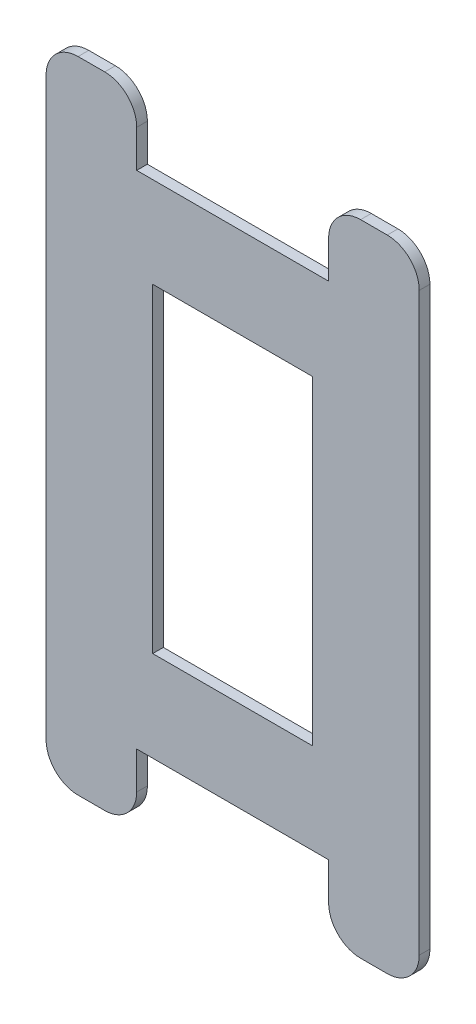
ISO-10303-21;
HEADER;
FILE_DESCRIPTION(('STEP AP214'),'2;1');
FILE_NAME('part.step','',(''),(''),'','','');
FILE_SCHEMA(('AUTOMOTIVE_DESIGN { 1 0 10303 214 1 1 1 1 }'));
ENDSEC;
DATA;
#1=APPLICATION_CONTEXT('core data for automotive mechanical design processes');
#2=APPLICATION_PROTOCOL_DEFINITION('international standard','automotive_design',2000,#1);
#3=PRODUCT_CONTEXT('',#1,'mechanical');
#4=PRODUCT('Part','Part','',(#3));
#5=PRODUCT_RELATED_PRODUCT_CATEGORY('part','',(#4));
#6=PRODUCT_DEFINITION_FORMATION('','',#4);
#7=PRODUCT_DEFINITION_CONTEXT('part definition',#1,'design');
#8=PRODUCT_DEFINITION('design','',#6,#7);
#9=PRODUCT_DEFINITION_SHAPE('','',#8);
#10=(LENGTH_UNIT() NAMED_UNIT(*) SI_UNIT(.MILLI.,.METRE.));
#11=(NAMED_UNIT(*) PLANE_ANGLE_UNIT() SI_UNIT($,.RADIAN.));
#12=(NAMED_UNIT(*) SI_UNIT($,.STERADIAN.) SOLID_ANGLE_UNIT());
#13=UNCERTAINTY_MEASURE_WITH_UNIT(LENGTH_MEASURE(1.E-05),#10,'distance_accuracy_value','');
#14=(GEOMETRIC_REPRESENTATION_CONTEXT(3) GLOBAL_UNCERTAINTY_ASSIGNED_CONTEXT((#13)) GLOBAL_UNIT_ASSIGNED_CONTEXT((#10,
#11,#12)) REPRESENTATION_CONTEXT('',''));
#15=CARTESIAN_POINT('',(0.,0.,0.));
#16=DIRECTION('',(0.,0.,1.));
#17=DIRECTION('',(1.,0.,0.));
#18=AXIS2_PLACEMENT_3D('',#15,#16,#17);
#19=CARTESIAN_POINT('',(54.4503896425,-22.42083694663,4.7927));
#20=DIRECTION('',(1.,0.,0.));
#21=DIRECTION('',(0.,1.,0.));
#22=AXIS2_PLACEMENT_3D('',#19,#20,#21);
#23=PLANE('',#22);
#24=DIRECTION('',(-1.00071054263569E-10,0.,-1.));
#25=VECTOR('',#24,1.);
#26=CARTESIAN_POINT('',(54.45038964251,-22.77083694664,4.79270000001));
#27=LINE('',#26,#25);
#28=CARTESIAN_POINT('',(54.4503896425,-22.77083694663,4.7927));
#29=VERTEX_POINT('',#28);
#30=CARTESIAN_POINT('',(54.4503896425,-22.77083694663,4.6927));
#31=VERTEX_POINT('',#30);
#32=EDGE_CURVE('E11',#29,#31,#27,.T.);
#33=ORIENTED_EDGE('',*,*,#32,.F.);
#34=DIRECTION('',(0.,1.,0.));
#35=VECTOR('',#34,1.);
#36=CARTESIAN_POINT('',(54.45038964251,-22.77083694664,4.79270000001));
#37=LINE('',#36,#35);
#38=CARTESIAN_POINT('',(54.4503896425,-22.42083694663,4.7927));
#39=VERTEX_POINT('',#38);
#40=EDGE_CURVE('E260',#29,#39,#37,.T.);
#41=ORIENTED_EDGE('',*,*,#40,.T.);
#42=DIRECTION('',(0.,0.,1.));
#43=VECTOR('',#42,1.);
#44=CARTESIAN_POINT('',(54.45038964251,-22.42083694664,4.69270000001));
#45=LINE('',#44,#43);
#46=CARTESIAN_POINT('',(54.4503896425,-22.42083694663,4.6927));
#47=VERTEX_POINT('',#46);
#48=EDGE_CURVE('E253',#47,#39,#45,.T.);
#49=ORIENTED_EDGE('',*,*,#48,.F.);
#50=DIRECTION('',(-2.85917297916334E-11,1.,0.));
#51=VECTOR('',#50,1.);
#52=CARTESIAN_POINT('',(54.45038964251,-22.77083694664,4.69270000001));
#53=LINE('',#52,#51);
#54=EDGE_CURVE('E235',#31,#47,#53,.T.);
#55=ORIENTED_EDGE('',*,*,#54,.F.);
#56=EDGE_LOOP('',(#33,#41,#49,#55));
#57=FACE_BOUND('',#56,.T.);
#58=ADVANCED_FACE('F17',(#57),#23,.F.);
#59=CARTESIAN_POINT('',(54.7503896425,-22.77083694663,4.7927));
#60=DIRECTION('',(0.,0.,-1.));
#61=DIRECTION('',(1.,0.,0.));
#62=AXIS2_PLACEMENT_3D('',#59,#60,#61);
#63=CYLINDRICAL_SURFACE('',#62,0.3);
#64=DIRECTION('',(0.,0.,1.));
#65=VECTOR('',#64,1.);
#66=CARTESIAN_POINT('',(54.75038964251,-23.07083694664,4.69270000001));
#67=LINE('',#66,#65);
#68=CARTESIAN_POINT('',(54.7503896425,-23.07083694663,4.6927));
#69=VERTEX_POINT('',#68);
#70=CARTESIAN_POINT('',(54.7503896425,-23.07083694663,4.7927));
#71=VERTEX_POINT('',#70);
#72=EDGE_CURVE('E27',#69,#71,#67,.T.);
#73=ORIENTED_EDGE('',*,*,#72,.T.);
#74=CARTESIAN_POINT('',(54.75038964251,-22.77083694664,4.79270000001));
#75=DIRECTION('',(0.,0.,1.));
#76=DIRECTION('',(-1.,3.35464961529431E-11,0.));
#77=AXIS2_PLACEMENT_3D('',#74,#75,#76);
#78=CIRCLE('',#77,0.30000000001);
#79=EDGE_CURVE('E417',#29,#71,#78,.T.);
#80=ORIENTED_EDGE('',*,*,#79,.F.);
#81=ORIENTED_EDGE('',*,*,#32,.T.);
#82=CARTESIAN_POINT('',(54.75038964251,-22.77083694664,4.69270000001));
#83=DIRECTION('',(0.,0.,-1.));
#84=DIRECTION('',(0.,-1.,0.));
#85=AXIS2_PLACEMENT_3D('',#82,#83,#84);
#86=CIRCLE('',#85,0.30000000001);
#87=EDGE_CURVE('E243',#69,#31,#86,.T.);
#88=ORIENTED_EDGE('',*,*,#87,.F.);
#89=EDGE_LOOP('',(#73,#80,#81,#88));
#90=FACE_BOUND('',#89,.T.);
#91=ADVANCED_FACE('F19',(#90),#63,.T.);
#92=CARTESIAN_POINT('',(54.7503896425,-23.07083694663,4.7927));
#93=DIRECTION('',(0.,1.,0.));
#94=DIRECTION('',(1.,0.,0.));
#95=AXIS2_PLACEMENT_3D('',#92,#93,#94);
#96=PLANE('',#95);
#97=DIRECTION('',(0.,0.,-1.));
#98=VECTOR('',#97,1.);
#99=CARTESIAN_POINT('',(55.00038964251,-23.07083694664,4.79270000001));
#100=LINE('',#99,#98);
#101=CARTESIAN_POINT('',(55.0003896425,-23.07083694663,4.7927));
#102=VERTEX_POINT('',#101);
#103=CARTESIAN_POINT('',(55.0003896425,-23.07083694663,4.6927));
#104=VERTEX_POINT('',#103);
#105=EDGE_CURVE('E392',#102,#104,#100,.T.);
#106=ORIENTED_EDGE('',*,*,#105,.F.);
#107=DIRECTION('',(-1.,0.,0.));
#108=VECTOR('',#107,1.);
#109=CARTESIAN_POINT('',(55.00038964251,-23.07083694664,4.79270000001));
#110=LINE('',#109,#108);
#111=EDGE_CURVE('E321',#102,#71,#110,.T.);
#112=ORIENTED_EDGE('',*,*,#111,.T.);
#113=ORIENTED_EDGE('',*,*,#72,.F.);
#114=DIRECTION('',(-1.,0.,0.));
#115=VECTOR('',#114,1.);
#116=CARTESIAN_POINT('',(55.00038964251,-23.07083694664,4.69270000001));
#117=LINE('',#116,#115);
#118=EDGE_CURVE('E371',#104,#69,#117,.T.);
#119=ORIENTED_EDGE('',*,*,#118,.F.);
#120=EDGE_LOOP('',(#106,#112,#113,#119));
#121=FACE_BOUND('',#120,.T.);
#122=ADVANCED_FACE('F518',(#121),#96,.F.);
#123=CARTESIAN_POINT('',(55.0003896425,-22.77083694663,4.7927));
#124=DIRECTION('',(0.,0.,-1.));
#125=DIRECTION('',(1.,0.,0.));
#126=AXIS2_PLACEMENT_3D('',#123,#124,#125);
#127=CYLINDRICAL_SURFACE('',#126,0.3);
#128=DIRECTION('',(0.,0.,1.));
#129=VECTOR('',#128,1.);
#130=CARTESIAN_POINT('',(55.30038964251,-22.77083694664,4.69270000001));
#131=LINE('',#130,#129);
#132=CARTESIAN_POINT('',(55.3003896425,-22.77083694663,4.6927));
#133=VERTEX_POINT('',#132);
#134=CARTESIAN_POINT('',(55.3003896425,-22.77083694663,4.7927));
#135=VERTEX_POINT('',#134);
#136=EDGE_CURVE('E21',#133,#135,#131,.T.);
#137=ORIENTED_EDGE('',*,*,#136,.T.);
#138=CARTESIAN_POINT('',(55.00038964251,-22.77083694664,4.79270000001));
#139=DIRECTION('',(0.,0.,1.));
#140=DIRECTION('',(0.,-1.,0.));
#141=AXIS2_PLACEMENT_3D('',#138,#139,#140);
#142=CIRCLE('',#141,0.30000000001);
#143=EDGE_CURVE('E316',#102,#135,#142,.T.);
#144=ORIENTED_EDGE('',*,*,#143,.F.);
#145=ORIENTED_EDGE('',*,*,#105,.T.);
#146=CARTESIAN_POINT('',(55.00038964251,-22.77083694664,4.69270000001));
#147=DIRECTION('',(0.,0.,-1.));
#148=DIRECTION('',(1.,-3.33451757111511E-11,0.));
#149=AXIS2_PLACEMENT_3D('',#146,#147,#148);
#150=CIRCLE('',#149,0.30000000001);
#151=EDGE_CURVE('E367',#133,#104,#150,.T.);
#152=ORIENTED_EDGE('',*,*,#151,.F.);
#153=EDGE_LOOP('',(#137,#144,#145,#152));
#154=FACE_BOUND('',#153,.T.);
#155=ADVANCED_FACE('F509',(#154),#127,.T.);
#156=CARTESIAN_POINT('',(55.3003896425,-17.37083694663,4.7927));
#157=DIRECTION('',(-1.,0.,0.));
#158=DIRECTION('',(0.,0.,1.));
#159=AXIS2_PLACEMENT_3D('',#156,#157,#158);
#160=PLANE('',#159);
#161=DIRECTION('',(0.,0.,-1.));
#162=VECTOR('',#161,1.);
#163=CARTESIAN_POINT('',(55.30038964251,-17.37083694664,4.79270000001));
#164=LINE('',#163,#162);
#165=CARTESIAN_POINT('',(55.3003896425,-17.37083694663,4.7927));
#166=VERTEX_POINT('',#165);
#167=CARTESIAN_POINT('',(55.3003896425,-17.37083694663,4.6927));
#168=VERTEX_POINT('',#167);
#169=EDGE_CURVE('E495',#166,#168,#164,.T.);
#170=ORIENTED_EDGE('',*,*,#169,.F.);
#171=DIRECTION('',(0.,-1.,0.));
#172=VECTOR('',#171,1.);
#173=CARTESIAN_POINT('',(55.30038964251,-17.37083694664,4.79270000001));
#174=LINE('',#173,#172);
#175=EDGE_CURVE('E320',#166,#135,#174,.T.);
#176=ORIENTED_EDGE('',*,*,#175,.T.);
#177=ORIENTED_EDGE('',*,*,#136,.F.);
#178=DIRECTION('',(0.,-1.,0.));
#179=VECTOR('',#178,1.);
#180=CARTESIAN_POINT('',(55.30038964251,-17.37083694664,4.69270000001));
#181=LINE('',#180,#179);
#182=EDGE_CURVE('E363',#168,#133,#181,.T.);
#183=ORIENTED_EDGE('',*,*,#182,.F.);
#184=EDGE_LOOP('',(#170,#176,#177,#183));
#185=FACE_BOUND('',#184,.T.);
#186=ADVANCED_FACE('F513',(#185),#160,.F.);
#187=CARTESIAN_POINT('',(55.0003896425,-17.37083694663,4.7927));
#188=DIRECTION('',(0.,0.,-1.));
#189=DIRECTION('',(1.,0.,0.));
#190=AXIS2_PLACEMENT_3D('',#187,#188,#189);
#191=CYLINDRICAL_SURFACE('',#190,0.3);
#192=DIRECTION('',(0.,0.,1.));
#193=VECTOR('',#192,1.);
#194=CARTESIAN_POINT('',(55.00038964251,-17.07083694664,4.69270000001));
#195=LINE('',#194,#193);
#196=CARTESIAN_POINT('',(55.0003896425,-17.07083694663,4.6927));
#197=VERTEX_POINT('',#196);
#198=CARTESIAN_POINT('',(55.0003896425,-17.07083694663,4.7927));
#199=VERTEX_POINT('',#198);
#200=EDGE_CURVE('E493',#197,#199,#195,.T.);
#201=ORIENTED_EDGE('',*,*,#200,.T.);
#202=CARTESIAN_POINT('',(55.00038964251,-17.37083694664,4.79270000001));
#203=DIRECTION('',(0.,0.,1.));
#204=DIRECTION('',(1.,0.,0.));
#205=AXIS2_PLACEMENT_3D('',#202,#203,#204);
#206=CIRCLE('',#205,0.30000000001);
#207=EDGE_CURVE('E383',#166,#199,#206,.T.);
#208=ORIENTED_EDGE('',*,*,#207,.F.);
#209=ORIENTED_EDGE('',*,*,#169,.T.);
#210=CARTESIAN_POINT('',(55.00038964251,-17.37083694664,4.69270000001));
#211=DIRECTION('',(0.,0.,-1.));
#212=DIRECTION('',(0.,1.,0.));
#213=AXIS2_PLACEMENT_3D('',#210,#211,#212);
#214=CIRCLE('',#213,0.30000000001);
#215=EDGE_CURVE('E359',#197,#168,#214,.T.);
#216=ORIENTED_EDGE('',*,*,#215,.F.);
#217=EDGE_LOOP('',(#201,#208,#209,#216));
#218=FACE_BOUND('',#217,.T.);
#219=ADVANCED_FACE('F521',(#218),#191,.T.);
#220=CARTESIAN_POINT('',(54.7503896425,-17.07083694663,4.7927));
#221=DIRECTION('',(0.,-1.,0.));
#222=DIRECTION('',(0.,0.,-1.));
#223=AXIS2_PLACEMENT_3D('',#220,#221,#222);
#224=PLANE('',#223);
#225=DIRECTION('',(0.,0.,-1.));
#226=VECTOR('',#225,1.);
#227=CARTESIAN_POINT('',(54.75038964251,-17.07083694664,4.79270000001));
#228=LINE('',#227,#226);
#229=CARTESIAN_POINT('',(54.7503896425,-17.07083694663,4.7927));
#230=VERTEX_POINT('',#229);
#231=CARTESIAN_POINT('',(54.7503896425,-17.07083694663,4.6927));
#232=VERTEX_POINT('',#231);
#233=EDGE_CURVE('E490',#230,#232,#228,.T.);
#234=ORIENTED_EDGE('',*,*,#233,.F.);
#235=DIRECTION('',(1.,0.,0.));
#236=VECTOR('',#235,1.);
#237=CARTESIAN_POINT('',(54.75038964251,-17.07083694664,4.79270000001));
#238=LINE('',#237,#236);
#239=EDGE_CURVE('E421',#230,#199,#238,.T.);
#240=ORIENTED_EDGE('',*,*,#239,.T.);
#241=ORIENTED_EDGE('',*,*,#200,.F.);
#242=DIRECTION('',(1.,0.,0.));
#243=VECTOR('',#242,1.);
#244=CARTESIAN_POINT('',(54.75038964251,-17.07083694664,4.69270000001));
#245=LINE('',#244,#243);
#246=EDGE_CURVE('E304',#232,#197,#245,.T.);
#247=ORIENTED_EDGE('',*,*,#246,.F.);
#248=EDGE_LOOP('',(#234,#240,#241,#247));
#249=FACE_BOUND('',#248,.T.);
#250=ADVANCED_FACE('F524',(#249),#224,.F.);
#251=CARTESIAN_POINT('',(54.7503896425,-17.37083694663,4.7927));
#252=DIRECTION('',(0.,0.,-1.));
#253=DIRECTION('',(1.,0.,0.));
#254=AXIS2_PLACEMENT_3D('',#251,#252,#253);
#255=CYLINDRICAL_SURFACE('',#254,0.3);
#256=DIRECTION('',(-1.00071054263569E-10,0.,1.));
#257=VECTOR('',#256,1.);
#258=CARTESIAN_POINT('',(54.45038964251,-17.37083694664,4.69270000001));
#259=LINE('',#258,#257);
#260=CARTESIAN_POINT('',(54.4503896425,-17.37083694663,4.6927));
#261=VERTEX_POINT('',#260);
#262=CARTESIAN_POINT('',(54.4503896425,-17.37083694663,4.7927));
#263=VERTEX_POINT('',#262);
#264=EDGE_CURVE('E280',#261,#263,#259,.T.);
#265=ORIENTED_EDGE('',*,*,#264,.T.);
#266=CARTESIAN_POINT('',(54.75038964251,-17.37083694664,4.79270000001));
#267=DIRECTION('',(0.,0.,1.));
#268=DIRECTION('',(0.,1.,0.));
#269=AXIS2_PLACEMENT_3D('',#266,#267,#268);
#270=CIRCLE('',#269,0.30000000001);
#271=EDGE_CURVE('E431',#230,#263,#270,.T.);
#272=ORIENTED_EDGE('',*,*,#271,.F.);
#273=ORIENTED_EDGE('',*,*,#233,.T.);
#274=CARTESIAN_POINT('',(54.75038964251,-17.37083694664,4.69270000001));
#275=DIRECTION('',(0.,0.,-1.));
#276=DIRECTION('',(-1.,-3.35346537740142E-11,0.));
#277=AXIS2_PLACEMENT_3D('',#274,#275,#276);
#278=CIRCLE('',#277,0.30000000001);
#279=EDGE_CURVE('E301',#261,#232,#278,.T.);
#280=ORIENTED_EDGE('',*,*,#279,.F.);
#281=EDGE_LOOP('',(#265,#272,#273,#280));
#282=FACE_BOUND('',#281,.T.);
#283=ADVANCED_FACE('F529',(#282),#255,.T.);
#284=CARTESIAN_POINT('',(54.4503896425,-17.72083694663,4.7927));
#285=DIRECTION('',(1.,0.,0.));
#286=DIRECTION('',(0.,1.,0.));
#287=AXIS2_PLACEMENT_3D('',#284,#285,#286);
#288=PLANE('',#287);
#289=DIRECTION('',(0.,0.,1.));
#290=VECTOR('',#289,1.);
#291=CARTESIAN_POINT('',(54.45038964251,-17.72083694664,4.69270000001));
#292=LINE('',#291,#290);
#293=CARTESIAN_POINT('',(54.4503896425,-17.72083694663,4.6927));
#294=VERTEX_POINT('',#293);
#295=CARTESIAN_POINT('',(54.4503896425,-17.72083694663,4.7927));
#296=VERTEX_POINT('',#295);
#297=EDGE_CURVE('E277',#294,#296,#292,.T.);
#298=ORIENTED_EDGE('',*,*,#297,.T.);
#299=DIRECTION('',(2.85917297916334E-11,1.,0.));
#300=VECTOR('',#299,1.);
#301=CARTESIAN_POINT('',(54.45038964251,-17.72083694664,4.79270000001));
#302=LINE('',#301,#300);
#303=EDGE_CURVE('E435',#296,#263,#302,.T.);
#304=ORIENTED_EDGE('',*,*,#303,.T.);
#305=ORIENTED_EDGE('',*,*,#264,.F.);
#306=DIRECTION('',(0.,1.,0.));
#307=VECTOR('',#306,1.);
#308=CARTESIAN_POINT('',(54.45038964251,-17.72083694664,4.69270000001));
#309=LINE('',#308,#307);
#310=EDGE_CURVE('E305',#294,#261,#309,.T.);
#311=ORIENTED_EDGE('',*,*,#310,.F.);
#312=EDGE_LOOP('',(#298,#304,#305,#311));
#313=FACE_BOUND('',#312,.T.);
#314=ADVANCED_FACE('F533',(#313),#288,.F.);
#315=CARTESIAN_POINT('',(52.6503896425,-17.72083694663,4.7927));
#316=DIRECTION('',(0.,-1.,0.));
#317=DIRECTION('',(0.,0.,-1.));
#318=AXIS2_PLACEMENT_3D('',#315,#316,#317);
#319=PLANE('',#318);
#320=DIRECTION('',(0.,0.,1.));
#321=VECTOR('',#320,1.);
#322=CARTESIAN_POINT('',(52.65038964251,-17.72083694664,4.69270000001));
#323=LINE('',#322,#321);
#324=CARTESIAN_POINT('',(52.6503896425,-17.72083694663,4.6927));
#325=VERTEX_POINT('',#324);
#326=CARTESIAN_POINT('',(52.6503896425,-17.72083694663,4.7927));
#327=VERTEX_POINT('',#326);
#328=EDGE_CURVE('E281',#325,#327,#323,.T.);
#329=ORIENTED_EDGE('',*,*,#328,.T.);
#330=DIRECTION('',(1.,0.,0.));
#331=VECTOR('',#330,1.);
#332=CARTESIAN_POINT('',(52.65038964251,-17.72083694664,4.79270000001));
#333=LINE('',#332,#331);
#334=EDGE_CURVE('E443',#327,#296,#333,.T.);
#335=ORIENTED_EDGE('',*,*,#334,.T.);
#336=ORIENTED_EDGE('',*,*,#297,.F.);
#337=DIRECTION('',(1.,0.,0.));
#338=VECTOR('',#337,1.);
#339=CARTESIAN_POINT('',(52.65038964251,-17.72083694664,4.69270000001));
#340=LINE('',#339,#338);
#341=EDGE_CURVE('E311',#325,#294,#340,.T.);
#342=ORIENTED_EDGE('',*,*,#341,.F.);
#343=EDGE_LOOP('',(#329,#335,#336,#342));
#344=FACE_BOUND('',#343,.T.);
#345=ADVANCED_FACE('F536',(#344),#319,.F.);
#346=CARTESIAN_POINT('',(52.6503896425,-17.72083694663,4.7927));
#347=DIRECTION('',(-1.,0.,0.));
#348=DIRECTION('',(0.,0.,1.));
#349=AXIS2_PLACEMENT_3D('',#346,#347,#348);
#350=PLANE('',#349);
#351=DIRECTION('',(0.,-1.00035527126784E-10,-1.));
#352=VECTOR('',#351,1.);
#353=CARTESIAN_POINT('',(52.65038964251,-17.37083694664,4.79270000001));
#354=LINE('',#353,#352);
#355=CARTESIAN_POINT('',(52.6503896425,-17.37083694663,4.7927));
#356=VERTEX_POINT('',#355);
#357=CARTESIAN_POINT('',(52.6503896425,-17.37083694663,4.6927));
#358=VERTEX_POINT('',#357);
#359=EDGE_CURVE('E343',#356,#358,#354,.T.);
#360=ORIENTED_EDGE('',*,*,#359,.F.);
#361=DIRECTION('',(0.,-1.,0.));
#362=VECTOR('',#361,1.);
#363=CARTESIAN_POINT('',(52.65038964251,-17.37083694664,4.79270000001));
#364=LINE('',#363,#362);
#365=EDGE_CURVE('E447',#356,#327,#364,.T.);
#366=ORIENTED_EDGE('',*,*,#365,.T.);
#367=ORIENTED_EDGE('',*,*,#328,.F.);
#368=DIRECTION('',(0.,-1.,0.));
#369=VECTOR('',#368,1.);
#370=CARTESIAN_POINT('',(52.65038964251,-17.37083694664,4.69270000001));
#371=LINE('',#370,#369);
#372=EDGE_CURVE('E315',#358,#325,#371,.T.);
#373=ORIENTED_EDGE('',*,*,#372,.F.);
#374=EDGE_LOOP('',(#360,#366,#367,#373));
#375=FACE_BOUND('',#374,.T.);
#376=ADVANCED_FACE('F541',(#375),#350,.F.);
#377=CARTESIAN_POINT('',(52.3503896425,-17.37083694663,4.7927));
#378=DIRECTION('',(0.,0.,-1.));
#379=DIRECTION('',(1.,0.,0.));
#380=AXIS2_PLACEMENT_3D('',#377,#378,#379);
#381=CYLINDRICAL_SURFACE('',#380,0.3);
#382=DIRECTION('',(0.,0.,1.));
#383=VECTOR('',#382,1.);
#384=CARTESIAN_POINT('',(52.35038964251,-17.07083694664,4.69270000001));
#385=LINE('',#384,#383);
#386=CARTESIAN_POINT('',(52.3503896425,-17.07083694663,4.6927));
#387=VERTEX_POINT('',#386);
#388=CARTESIAN_POINT('',(52.3503896425,-17.07083694663,4.7927));
#389=VERTEX_POINT('',#388);
#390=EDGE_CURVE('E293',#387,#389,#385,.T.);
#391=ORIENTED_EDGE('',*,*,#390,.T.);
#392=CARTESIAN_POINT('',(52.35038964251,-17.37083694664,4.79270000001));
#393=DIRECTION('',(0.,0.,1.));
#394=DIRECTION('',(1.,-3.35464961529431E-11,0.));
#395=AXIS2_PLACEMENT_3D('',#392,#393,#394);
#396=CIRCLE('',#395,0.30000000001);
#397=EDGE_CURVE('E439',#356,#389,#396,.T.);
#398=ORIENTED_EDGE('',*,*,#397,.F.);
#399=ORIENTED_EDGE('',*,*,#359,.T.);
#400=CARTESIAN_POINT('',(52.35038964251,-17.37083694664,4.69270000001));
#401=DIRECTION('',(0.,0.,-1.));
#402=DIRECTION('',(0.,1.,0.));
#403=AXIS2_PLACEMENT_3D('',#400,#401,#402);
#404=CIRCLE('',#403,0.30000000001);
#405=EDGE_CURVE('E322',#387,#358,#404,.T.);
#406=ORIENTED_EDGE('',*,*,#405,.F.);
#407=EDGE_LOOP('',(#391,#398,#399,#406));
#408=FACE_BOUND('',#407,.T.);
#409=ADVANCED_FACE('F545',(#408),#381,.T.);
#410=CARTESIAN_POINT('',(52.3503896425,-17.07083694663,4.7927));
#411=DIRECTION('',(0.,-1.,0.));
#412=DIRECTION('',(0.,0.,-1.));
#413=AXIS2_PLACEMENT_3D('',#410,#411,#412);
#414=PLANE('',#413);
#415=DIRECTION('',(0.,0.,-1.));
#416=VECTOR('',#415,1.);
#417=CARTESIAN_POINT('',(52.10038964251,-17.07083694664,4.79270000001));
#418=LINE('',#417,#416);
#419=CARTESIAN_POINT('',(52.1003896425,-17.07083694663,4.7927));
#420=VERTEX_POINT('',#419);
#421=CARTESIAN_POINT('',(52.1003896425,-17.07083694663,4.6927));
#422=VERTEX_POINT('',#421);
#423=EDGE_CURVE('E290',#420,#422,#418,.T.);
#424=ORIENTED_EDGE('',*,*,#423,.F.);
#425=DIRECTION('',(1.,0.,0.));
#426=VECTOR('',#425,1.);
#427=CARTESIAN_POINT('',(52.10038964251,-17.07083694664,4.79270000001));
#428=LINE('',#427,#426);
#429=EDGE_CURVE('E352',#420,#389,#428,.T.);
#430=ORIENTED_EDGE('',*,*,#429,.T.);
#431=ORIENTED_EDGE('',*,*,#390,.F.);
#432=DIRECTION('',(1.,0.,0.));
#433=VECTOR('',#432,1.);
#434=CARTESIAN_POINT('',(52.10038964251,-17.07083694664,4.69270000001));
#435=LINE('',#434,#433);
#436=EDGE_CURVE('E326',#422,#387,#435,.T.);
#437=ORIENTED_EDGE('',*,*,#436,.F.);
#438=EDGE_LOOP('',(#424,#430,#431,#437));
#439=FACE_BOUND('',#438,.T.);
#440=ADVANCED_FACE('F548',(#439),#414,.F.);
#441=CARTESIAN_POINT('',(52.1003896425,-17.37083694663,4.7927));
#442=DIRECTION('',(0.,0.,-1.));
#443=DIRECTION('',(1.,0.,0.));
#444=AXIS2_PLACEMENT_3D('',#441,#442,#443);
#445=CYLINDRICAL_SURFACE('',#444,0.3);
#446=DIRECTION('',(0.,0.,1.));
#447=VECTOR('',#446,1.);
#448=CARTESIAN_POINT('',(51.80038964251,-17.37083694664,4.69270000001));
#449=LINE('',#448,#447);
#450=CARTESIAN_POINT('',(51.8003896425,-17.37083694663,4.6927));
#451=VERTEX_POINT('',#450);
#452=CARTESIAN_POINT('',(51.8003896425,-17.37083694663,4.7927));
#453=VERTEX_POINT('',#452);
#454=EDGE_CURVE('E294',#451,#453,#449,.T.);
#455=ORIENTED_EDGE('',*,*,#454,.T.);
#456=CARTESIAN_POINT('',(52.10038964251,-17.37083694664,4.79270000001));
#457=DIRECTION('',(0.,0.,1.));
#458=DIRECTION('',(0.,1.,0.));
#459=AXIS2_PLACEMENT_3D('',#456,#457,#458);
#460=CIRCLE('',#459,0.30000000001);
#461=EDGE_CURVE('E347',#420,#453,#460,.T.);
#462=ORIENTED_EDGE('',*,*,#461,.F.);
#463=ORIENTED_EDGE('',*,*,#423,.T.);
#464=CARTESIAN_POINT('',(52.10038964251,-17.37083694664,4.69270000001));
#465=DIRECTION('',(0.,0.,-1.));
#466=DIRECTION('',(-1.,0.,0.));
#467=AXIS2_PLACEMENT_3D('',#464,#465,#466);
#468=CIRCLE('',#467,0.30000000001);
#469=EDGE_CURVE('E310',#451,#422,#468,.T.);
#470=ORIENTED_EDGE('',*,*,#469,.F.);
#471=EDGE_LOOP('',(#455,#462,#463,#470));
#472=FACE_BOUND('',#471,.T.);
#473=ADVANCED_FACE('F552',(#472),#445,.T.);
#474=CARTESIAN_POINT('',(51.8003896425,-17.37083694663,4.7927));
#475=DIRECTION('',(1.,0.,0.));
#476=DIRECTION('',(0.,1.,0.));
#477=AXIS2_PLACEMENT_3D('',#474,#475,#476);
#478=PLANE('',#477);
#479=DIRECTION('',(0.,0.,-1.));
#480=VECTOR('',#479,1.);
#481=CARTESIAN_POINT('',(51.80038964251,-22.77083694664,4.79270000001));
#482=LINE('',#481,#480);
#483=CARTESIAN_POINT('',(51.8003896425,-22.77083694663,4.7927));
#484=VERTEX_POINT('',#483);
#485=CARTESIAN_POINT('',(51.8003896425,-22.77083694663,4.6927));
#486=VERTEX_POINT('',#485);
#487=EDGE_CURVE('E330',#484,#486,#482,.T.);
#488=ORIENTED_EDGE('',*,*,#487,.F.);
#489=DIRECTION('',(0.,1.,0.));
#490=VECTOR('',#489,1.);
#491=CARTESIAN_POINT('',(51.80038964251,-22.77083694664,4.79270000001));
#492=LINE('',#491,#490);
#493=EDGE_CURVE('E351',#484,#453,#492,.T.);
#494=ORIENTED_EDGE('',*,*,#493,.T.);
#495=ORIENTED_EDGE('',*,*,#454,.F.);
#496=DIRECTION('',(0.,1.,0.));
#497=VECTOR('',#496,1.);
#498=CARTESIAN_POINT('',(51.80038964251,-22.77083694664,4.69270000001));
#499=LINE('',#498,#497);
#500=EDGE_CURVE('E275',#486,#451,#499,.T.);
#501=ORIENTED_EDGE('',*,*,#500,.F.);
#502=EDGE_LOOP('',(#488,#494,#495,#501));
#503=FACE_BOUND('',#502,.T.);
#504=ADVANCED_FACE('F556',(#503),#478,.F.);
#505=CARTESIAN_POINT('',(52.1003896425,-22.77083694663,4.7927));
#506=DIRECTION('',(0.,0.,-1.));
#507=DIRECTION('',(1.,0.,0.));
#508=AXIS2_PLACEMENT_3D('',#505,#506,#507);
#509=CYLINDRICAL_SURFACE('',#508,0.3);
#510=DIRECTION('',(0.,0.,1.));
#511=VECTOR('',#510,1.);
#512=CARTESIAN_POINT('',(52.10038964251,-23.07083694664,4.69270000001));
#513=LINE('',#512,#511);
#514=CARTESIAN_POINT('',(52.1003896425,-23.07083694663,4.6927));
#515=VERTEX_POINT('',#514);
#516=CARTESIAN_POINT('',(52.1003896425,-23.07083694663,4.7927));
#517=VERTEX_POINT('',#516);
#518=EDGE_CURVE('E333',#515,#517,#513,.T.);
#519=ORIENTED_EDGE('',*,*,#518,.T.);
#520=CARTESIAN_POINT('',(52.10038964251,-22.77083694664,4.79270000001));
#521=DIRECTION('',(0.,0.,1.));
#522=DIRECTION('',(-1.,0.,0.));
#523=AXIS2_PLACEMENT_3D('',#520,#521,#522);
#524=CIRCLE('',#523,0.30000000001);
#525=EDGE_CURVE('E395',#484,#517,#524,.T.);
#526=ORIENTED_EDGE('',*,*,#525,.F.);
#527=ORIENTED_EDGE('',*,*,#487,.T.);
#528=CARTESIAN_POINT('',(52.10038964251,-22.77083694664,4.69270000001));
#529=DIRECTION('',(0.,0.,-1.));
#530=DIRECTION('',(0.,-1.,0.));
#531=AXIS2_PLACEMENT_3D('',#528,#529,#530);
#532=CIRCLE('',#531,0.30000000001);
#533=EDGE_CURVE('E271',#515,#486,#532,.T.);
#534=ORIENTED_EDGE('',*,*,#533,.F.);
#535=EDGE_LOOP('',(#519,#526,#527,#534));
#536=FACE_BOUND('',#535,.T.);
#537=ADVANCED_FACE('F560',(#536),#509,.T.);
#538=CARTESIAN_POINT('',(52.3503896425,-23.07083694663,4.7927));
#539=DIRECTION('',(0.,1.,0.));
#540=DIRECTION('',(1.,0.,0.));
#541=AXIS2_PLACEMENT_3D('',#538,#539,#540);
#542=PLANE('',#541);
#543=DIRECTION('',(0.,0.,-1.));
#544=VECTOR('',#543,1.);
#545=CARTESIAN_POINT('',(52.35038964251,-23.07083694664,4.79270000001));
#546=LINE('',#545,#544);
#547=CARTESIAN_POINT('',(52.3503896425,-23.07083694663,4.7927));
#548=VERTEX_POINT('',#547);
#549=CARTESIAN_POINT('',(52.3503896425,-23.07083694663,4.6927));
#550=VERTEX_POINT('',#549);
#551=EDGE_CURVE('E477',#548,#550,#546,.T.);
#552=ORIENTED_EDGE('',*,*,#551,.F.);
#553=DIRECTION('',(-1.,0.,0.));
#554=VECTOR('',#553,1.);
#555=CARTESIAN_POINT('',(52.35038964251,-23.07083694664,4.79270000001));
#556=LINE('',#555,#554);
#557=EDGE_CURVE('E399',#548,#517,#556,.T.);
#558=ORIENTED_EDGE('',*,*,#557,.T.);
#559=ORIENTED_EDGE('',*,*,#518,.F.);
#560=DIRECTION('',(-1.,0.,0.));
#561=VECTOR('',#560,1.);
#562=CARTESIAN_POINT('',(52.35038964251,-23.07083694664,4.69270000001));
#563=LINE('',#562,#561);
#564=EDGE_CURVE('E276',#550,#515,#563,.T.);
#565=ORIENTED_EDGE('',*,*,#564,.F.);
#566=EDGE_LOOP('',(#552,#558,#559,#565));
#567=FACE_BOUND('',#566,.T.);
#568=ADVANCED_FACE('F564',(#567),#542,.F.);
#569=CARTESIAN_POINT('',(52.3503896425,-22.77083694663,4.7927));
#570=DIRECTION('',(0.,0.,-1.));
#571=DIRECTION('',(1.,0.,0.));
#572=AXIS2_PLACEMENT_3D('',#569,#570,#571);
#573=CYLINDRICAL_SURFACE('',#572,0.3);
#574=DIRECTION('',(0.,0.,1.));
#575=VECTOR('',#574,1.);
#576=CARTESIAN_POINT('',(52.65038964251,-22.77083694664,4.69270000001));
#577=LINE('',#576,#575);
#578=CARTESIAN_POINT('',(52.6503896425,-22.77083694663,4.6927));
#579=VERTEX_POINT('',#578);
#580=CARTESIAN_POINT('',(52.6503896425,-22.77083694663,4.7927));
#581=VERTEX_POINT('',#580);
#582=EDGE_CURVE('E285',#579,#581,#577,.T.);
#583=ORIENTED_EDGE('',*,*,#582,.T.);
#584=CARTESIAN_POINT('',(52.35038964251,-22.77083694664,4.79270000001));
#585=DIRECTION('',(0.,0.,1.));
#586=DIRECTION('',(0.,-1.,0.));
#587=AXIS2_PLACEMENT_3D('',#584,#585,#586);
#588=CIRCLE('',#587,0.30000000001);
#589=EDGE_CURVE('E454',#548,#581,#588,.T.);
#590=ORIENTED_EDGE('',*,*,#589,.F.);
#591=ORIENTED_EDGE('',*,*,#551,.T.);
#592=CARTESIAN_POINT('',(52.35038964251,-22.77083694664,4.69270000001));
#593=DIRECTION('',(0.,0.,-1.));
#594=DIRECTION('',(1.,3.35346537740142E-11,0.));
#595=AXIS2_PLACEMENT_3D('',#592,#593,#594);
#596=CIRCLE('',#595,0.30000000001);
#597=EDGE_CURVE('E289',#579,#550,#596,.T.);
#598=ORIENTED_EDGE('',*,*,#597,.F.);
#599=EDGE_LOOP('',(#583,#590,#591,#598));
#600=FACE_BOUND('',#599,.T.);
#601=ADVANCED_FACE('F568',(#600),#573,.T.);
#602=CARTESIAN_POINT('',(52.6503896425,-22.42083694663,4.7927));
#603=DIRECTION('',(-1.,0.,0.));
#604=DIRECTION('',(0.,0.,1.));
#605=AXIS2_PLACEMENT_3D('',#602,#603,#604);
#606=PLANE('',#605);
#607=DIRECTION('',(0.,0.,1.));
#608=VECTOR('',#607,1.);
#609=CARTESIAN_POINT('',(52.65038964251,-22.42083694664,4.69270000001));
#610=LINE('',#609,#608);
#611=CARTESIAN_POINT('',(52.6503896425,-22.42083694663,4.6927));
#612=VERTEX_POINT('',#611);
#613=CARTESIAN_POINT('',(52.6503896425,-22.42083694663,4.7927));
#614=VERTEX_POINT('',#613);
#615=EDGE_CURVE('E255',#612,#614,#610,.T.);
#616=ORIENTED_EDGE('',*,*,#615,.T.);
#617=DIRECTION('',(0.,-1.,0.));
#618=VECTOR('',#617,1.);
#619=CARTESIAN_POINT('',(52.65038964251,-22.42083694664,4.79270000001));
#620=LINE('',#619,#618);
#621=EDGE_CURVE('E379',#614,#581,#620,.T.);
#622=ORIENTED_EDGE('',*,*,#621,.T.);
#623=ORIENTED_EDGE('',*,*,#582,.F.);
#624=DIRECTION('',(0.,-1.,0.));
#625=VECTOR('',#624,1.);
#626=CARTESIAN_POINT('',(52.65038964251,-22.42083694664,4.69270000001));
#627=LINE('',#626,#625);
#628=EDGE_CURVE('E257',#612,#579,#627,.T.);
#629=ORIENTED_EDGE('',*,*,#628,.F.);
#630=EDGE_LOOP('',(#616,#622,#623,#629));
#631=FACE_BOUND('',#630,.T.);
#632=ADVANCED_FACE('F570',(#631),#606,.F.);
#633=CARTESIAN_POINT('',(54.3003896425,-21.57083694663,4.6927));
#634=DIRECTION('',(1.,0.,0.));
#635=DIRECTION('',(0.,1.,0.));
#636=AXIS2_PLACEMENT_3D('',#633,#634,#635);
#637=PLANE('',#636);
#638=DIRECTION('',(0.,0.,-1.));
#639=VECTOR('',#638,1.);
#640=CARTESIAN_POINT('',(54.30038964251,-18.57083694664,4.79270000001));
#641=LINE('',#640,#639);
#642=CARTESIAN_POINT('',(54.3003896425,-18.57083694663,4.7927));
#643=VERTEX_POINT('',#642);
#644=CARTESIAN_POINT('',(54.3003896425,-18.57083694663,4.6927));
#645=VERTEX_POINT('',#644);
#646=EDGE_CURVE('E406',#643,#645,#641,.T.);
#647=ORIENTED_EDGE('',*,*,#646,.T.);
#648=DIRECTION('',(0.,-1.,0.));
#649=VECTOR('',#648,1.);
#650=CARTESIAN_POINT('',(54.30038964251,-18.57083694664,4.69270000001));
#651=LINE('',#650,#649);
#652=CARTESIAN_POINT('',(54.3003896425,-21.57083694663,4.6927));
#653=VERTEX_POINT('',#652);
#654=EDGE_CURVE('E388',#645,#653,#651,.T.);
#655=ORIENTED_EDGE('',*,*,#654,.T.);
#656=DIRECTION('',(0.,0.,-1.));
#657=VECTOR('',#656,1.);
#658=CARTESIAN_POINT('',(54.30038964251,-21.57083694664,4.79270000001));
#659=LINE('',#658,#657);
#660=CARTESIAN_POINT('',(54.3003896425,-21.57083694663,4.7927));
#661=VERTEX_POINT('',#660);
#662=EDGE_CURVE('E50',#661,#653,#659,.T.);
#663=ORIENTED_EDGE('',*,*,#662,.F.);
#664=DIRECTION('',(0.,-1.,0.));
#665=VECTOR('',#664,1.);
#666=CARTESIAN_POINT('',(54.30038964251,-18.57083694664,4.79270000001));
#667=LINE('',#666,#665);
#668=EDGE_CURVE('E374',#643,#661,#667,.T.);
#669=ORIENTED_EDGE('',*,*,#668,.F.);
#670=EDGE_LOOP('',(#647,#655,#663,#669));
#671=FACE_BOUND('',#670,.T.);
#672=ADVANCED_FACE('F572',(#671),#637,.F.);
#673=CARTESIAN_POINT('',(52.8003896425,-21.57083694663,4.6927));
#674=DIRECTION('',(0.,-1.,0.));
#675=DIRECTION('',(0.,0.,-1.));
#676=AXIS2_PLACEMENT_3D('',#673,#674,#675);
#677=PLANE('',#676);
#678=ORIENTED_EDGE('',*,*,#662,.T.);
#679=DIRECTION('',(-1.,0.,0.));
#680=VECTOR('',#679,1.);
#681=CARTESIAN_POINT('',(54.30038964251,-21.57083694664,4.69270000001));
#682=LINE('',#681,#680);
#683=CARTESIAN_POINT('',(52.8003896425,-21.57083694663,4.6927));
#684=VERTEX_POINT('',#683);
#685=EDGE_CURVE('E337',#653,#684,#682,.T.);
#686=ORIENTED_EDGE('',*,*,#685,.T.);
#687=DIRECTION('',(0.,0.,-1.));
#688=VECTOR('',#687,1.);
#689=CARTESIAN_POINT('',(52.80038964251,-21.57083694664,4.79270000001));
#690=LINE('',#689,#688);
#691=CARTESIAN_POINT('',(52.8003896425,-21.57083694663,4.7927));
#692=VERTEX_POINT('',#691);
#693=EDGE_CURVE('E40',#692,#684,#690,.T.);
#694=ORIENTED_EDGE('',*,*,#693,.F.);
#695=DIRECTION('',(-1.,0.,0.));
#696=VECTOR('',#695,1.);
#697=CARTESIAN_POINT('',(54.30038964251,-21.57083694664,4.79270000001));
#698=LINE('',#697,#696);
#699=EDGE_CURVE('E378',#661,#692,#698,.T.);
#700=ORIENTED_EDGE('',*,*,#699,.F.);
#701=EDGE_LOOP('',(#678,#686,#694,#700));
#702=FACE_BOUND('',#701,.T.);
#703=ADVANCED_FACE('F580',(#702),#677,.F.);
#704=CARTESIAN_POINT('',(52.8003896425,-21.57083694663,4.6927));
#705=DIRECTION('',(-1.,0.,0.));
#706=DIRECTION('',(0.,0.,1.));
#707=AXIS2_PLACEMENT_3D('',#704,#705,#706);
#708=PLANE('',#707);
#709=ORIENTED_EDGE('',*,*,#693,.T.);
#710=DIRECTION('',(0.,1.,0.));
#711=VECTOR('',#710,1.);
#712=CARTESIAN_POINT('',(52.80038964251,-21.57083694664,4.69270000001));
#713=LINE('',#712,#711);
#714=CARTESIAN_POINT('',(52.8003896425,-18.57083694663,4.6927));
#715=VERTEX_POINT('',#714);
#716=EDGE_CURVE('E247',#684,#715,#713,.T.);
#717=ORIENTED_EDGE('',*,*,#716,.T.);
#718=DIRECTION('',(0.,0.,-1.));
#719=VECTOR('',#718,1.);
#720=CARTESIAN_POINT('',(52.80038964251,-18.57083694664,4.79270000001));
#721=LINE('',#720,#719);
#722=CARTESIAN_POINT('',(52.8003896425,-18.57083694663,4.7927));
#723=VERTEX_POINT('',#722);
#724=EDGE_CURVE('E403',#723,#715,#721,.T.);
#725=ORIENTED_EDGE('',*,*,#724,.F.);
#726=DIRECTION('',(0.,1.,0.));
#727=VECTOR('',#726,1.);
#728=CARTESIAN_POINT('',(52.80038964251,-21.57083694664,4.79270000001));
#729=LINE('',#728,#727);
#730=EDGE_CURVE('E470',#692,#723,#729,.T.);
#731=ORIENTED_EDGE('',*,*,#730,.F.);
#732=EDGE_LOOP('',(#709,#717,#725,#731));
#733=FACE_BOUND('',#732,.T.);
#734=ADVANCED_FACE('F593',(#733),#708,.F.);
#735=CARTESIAN_POINT('',(54.7503896425,-22.77083694663,4.7927));
#736=DIRECTION('',(0.,0.,-1.));
#737=DIRECTION('',(0.,-1.,0.));
#738=AXIS2_PLACEMENT_3D('',#735,#736,#737);
#739=PLANE('',#738);
#740=DIRECTION('',(1.,0.,0.));
#741=VECTOR('',#740,1.);
#742=CARTESIAN_POINT('',(52.80038964251,-18.57083694664,4.79270000001));
#743=LINE('',#742,#741);
#744=EDGE_CURVE('E409',#723,#643,#743,.T.);
#745=ORIENTED_EDGE('',*,*,#744,.T.);
#746=ORIENTED_EDGE('',*,*,#668,.T.);
#747=ORIENTED_EDGE('',*,*,#699,.T.);
#748=ORIENTED_EDGE('',*,*,#730,.T.);
#749=EDGE_LOOP('',(#745,#746,#747,#748));
#750=FACE_BOUND('',#749,.T.);
#751=ORIENTED_EDGE('',*,*,#40,.F.);
#752=ORIENTED_EDGE('',*,*,#79,.T.);
#753=ORIENTED_EDGE('',*,*,#111,.F.);
#754=ORIENTED_EDGE('',*,*,#143,.T.);
#755=ORIENTED_EDGE('',*,*,#175,.F.);
#756=ORIENTED_EDGE('',*,*,#207,.T.);
#757=ORIENTED_EDGE('',*,*,#239,.F.);
#758=ORIENTED_EDGE('',*,*,#271,.T.);
#759=ORIENTED_EDGE('',*,*,#303,.F.);
#760=ORIENTED_EDGE('',*,*,#334,.F.);
#761=ORIENTED_EDGE('',*,*,#365,.F.);
#762=ORIENTED_EDGE('',*,*,#397,.T.);
#763=ORIENTED_EDGE('',*,*,#429,.F.);
#764=ORIENTED_EDGE('',*,*,#461,.T.);
#765=ORIENTED_EDGE('',*,*,#493,.F.);
#766=ORIENTED_EDGE('',*,*,#525,.T.);
#767=ORIENTED_EDGE('',*,*,#557,.F.);
#768=ORIENTED_EDGE('',*,*,#589,.T.);
#769=ORIENTED_EDGE('',*,*,#621,.F.);
#770=DIRECTION('',(-1.,0.,0.));
#771=VECTOR('',#770,1.);
#772=CARTESIAN_POINT('',(54.45038964251,-22.42083694664,4.79270000001));
#773=LINE('',#772,#771);
#774=EDGE_CURVE('E263',#39,#614,#773,.T.);
#775=ORIENTED_EDGE('',*,*,#774,.F.);
#776=EDGE_LOOP('',(#751,#752,#753,#754,#755,#756,#757,#758,#759,#760,#761,#762,#763,#764,#765,
#766,#767,#768,#769,#775));
#777=FACE_BOUND('',#776,.T.);
#778=ADVANCED_FACE('F515',(#750,#777),#739,.F.);
#779=CARTESIAN_POINT('',(52.8003896425,-18.57083694663,4.6927));
#780=DIRECTION('',(0.,1.,0.));
#781=DIRECTION('',(1.,0.,0.));
#782=AXIS2_PLACEMENT_3D('',#779,#780,#781);
#783=PLANE('',#782);
#784=ORIENTED_EDGE('',*,*,#724,.T.);
#785=DIRECTION('',(1.,0.,0.));
#786=VECTOR('',#785,1.);
#787=CARTESIAN_POINT('',(52.80038964251,-18.57083694664,4.69270000001));
#788=LINE('',#787,#786);
#789=EDGE_CURVE('E391',#715,#645,#788,.T.);
#790=ORIENTED_EDGE('',*,*,#789,.T.);
#791=ORIENTED_EDGE('',*,*,#646,.F.);
#792=ORIENTED_EDGE('',*,*,#744,.F.);
#793=EDGE_LOOP('',(#784,#790,#791,#792));
#794=FACE_BOUND('',#793,.T.);
#795=ADVANCED_FACE('F613',(#794),#783,.F.);
#796=CARTESIAN_POINT('',(54.7503896425,-22.77083694663,4.6927));
#797=DIRECTION('',(0.,0.,-1.));
#798=DIRECTION('',(0.,-1.,0.));
#799=AXIS2_PLACEMENT_3D('',#796,#797,#798);
#800=PLANE('',#799);
#801=ORIENTED_EDGE('',*,*,#716,.F.);
#802=ORIENTED_EDGE('',*,*,#685,.F.);
#803=ORIENTED_EDGE('',*,*,#654,.F.);
#804=ORIENTED_EDGE('',*,*,#789,.F.);
#805=EDGE_LOOP('',(#801,#802,#803,#804));
#806=FACE_BOUND('',#805,.T.);
#807=ORIENTED_EDGE('',*,*,#628,.T.);
#808=ORIENTED_EDGE('',*,*,#597,.T.);
#809=ORIENTED_EDGE('',*,*,#564,.T.);
#810=ORIENTED_EDGE('',*,*,#533,.T.);
#811=ORIENTED_EDGE('',*,*,#500,.T.);
#812=ORIENTED_EDGE('',*,*,#469,.T.);
#813=ORIENTED_EDGE('',*,*,#436,.T.);
#814=ORIENTED_EDGE('',*,*,#405,.T.);
#815=ORIENTED_EDGE('',*,*,#372,.T.);
#816=ORIENTED_EDGE('',*,*,#341,.T.);
#817=ORIENTED_EDGE('',*,*,#310,.T.);
#818=ORIENTED_EDGE('',*,*,#279,.T.);
#819=ORIENTED_EDGE('',*,*,#246,.T.);
#820=ORIENTED_EDGE('',*,*,#215,.T.);
#821=ORIENTED_EDGE('',*,*,#182,.T.);
#822=ORIENTED_EDGE('',*,*,#151,.T.);
#823=ORIENTED_EDGE('',*,*,#118,.T.);
#824=ORIENTED_EDGE('',*,*,#87,.T.);
#825=ORIENTED_EDGE('',*,*,#54,.T.);
#826=DIRECTION('',(-1.,0.,0.));
#827=VECTOR('',#826,1.);
#828=CARTESIAN_POINT('',(54.45038964251,-22.42083694664,4.69270000001));
#829=LINE('',#828,#827);
#830=EDGE_CURVE('E239',#47,#612,#829,.T.);
#831=ORIENTED_EDGE('',*,*,#830,.T.);
#832=EDGE_LOOP('',(#807,#808,#809,#810,#811,#812,#813,#814,#815,#816,#817,#818,#819,#820,#821,
#822,#823,#824,#825,#831));
#833=FACE_BOUND('',#832,.T.);
#834=ADVANCED_FACE('F238',(#806,#833),#800,.T.);
#835=CARTESIAN_POINT('',(52.6503896425,-22.42083694663,4.7927));
#836=DIRECTION('',(0.,1.,0.));
#837=DIRECTION('',(1.,0.,0.));
#838=AXIS2_PLACEMENT_3D('',#835,#836,#837);
#839=PLANE('',#838);
#840=ORIENTED_EDGE('',*,*,#48,.T.);
#841=ORIENTED_EDGE('',*,*,#774,.T.);
#842=ORIENTED_EDGE('',*,*,#615,.F.);
#843=ORIENTED_EDGE('',*,*,#830,.F.);
#844=EDGE_LOOP('',(#840,#841,#842,#843));
#845=FACE_BOUND('',#844,.T.);
#846=ADVANCED_FACE('F251',(#845),#839,.F.);
#847=CLOSED_SHELL('',(#58,#91,#122,#155,#186,#219,#250,#283,#314,#345,#376,#409,#440,#473,#504,
#537,#568,#601,#632,#672,#703,#734,#778,#795,#834,#846));
#848=MANIFOLD_SOLID_BREP('B1',#847);
#849=ADVANCED_BREP_SHAPE_REPRESENTATION('',(#18,#848),#14);
#850=SHAPE_DEFINITION_REPRESENTATION(#9,#849);
ENDSEC;
END-ISO-10303-21;
